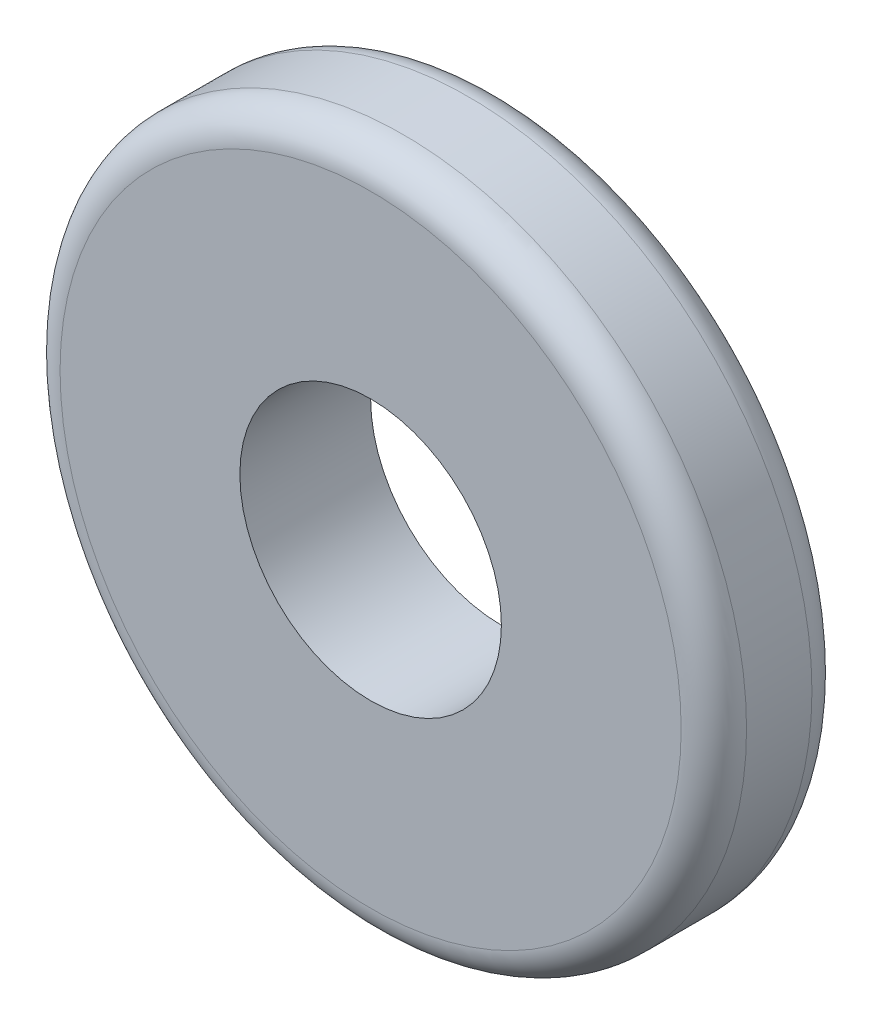
ISO-10303-21;
HEADER;
FILE_DESCRIPTION(('STEP AP214'),'2;1');
FILE_NAME('part.step','',(''),(''),'','','');
FILE_SCHEMA(('AUTOMOTIVE_DESIGN { 1 0 10303 214 1 1 1 1 }'));
ENDSEC;
DATA;
#1=APPLICATION_CONTEXT('core data for automotive mechanical design processes');
#2=APPLICATION_PROTOCOL_DEFINITION('international standard','automotive_design',2000,#1);
#3=PRODUCT_CONTEXT('',#1,'mechanical');
#4=PRODUCT('Part','Part','',(#3));
#5=PRODUCT_RELATED_PRODUCT_CATEGORY('part','',(#4));
#6=PRODUCT_DEFINITION_FORMATION('','',#4);
#7=PRODUCT_DEFINITION_CONTEXT('part definition',#1,'design');
#8=PRODUCT_DEFINITION('design','',#6,#7);
#9=PRODUCT_DEFINITION_SHAPE('','',#8);
#10=(LENGTH_UNIT() NAMED_UNIT(*) SI_UNIT(.MILLI.,.METRE.));
#11=(NAMED_UNIT(*) PLANE_ANGLE_UNIT() SI_UNIT($,.RADIAN.));
#12=(NAMED_UNIT(*) SI_UNIT($,.STERADIAN.) SOLID_ANGLE_UNIT());
#13=UNCERTAINTY_MEASURE_WITH_UNIT(LENGTH_MEASURE(1.E-05),#10,'distance_accuracy_value','');
#14=(GEOMETRIC_REPRESENTATION_CONTEXT(3) GLOBAL_UNCERTAINTY_ASSIGNED_CONTEXT((#13)) GLOBAL_UNIT_ASSIGNED_CONTEXT((#10,
#11,#12)) REPRESENTATION_CONTEXT('',''));
#15=CARTESIAN_POINT('',(0.,0.,0.));
#16=DIRECTION('',(0.,0.,1.));
#17=DIRECTION('',(1.,0.,0.));
#18=AXIS2_PLACEMENT_3D('',#15,#16,#17);
#19=CARTESIAN_POINT('',(0.,0.,4.));
#20=DIRECTION('',(0.,0.,1.));
#21=DIRECTION('',(1.,0.,0.));
#22=AXIS2_PLACEMENT_3D('',#19,#20,#21);
#23=PLANE('',#22);
#24=CARTESIAN_POINT('',(0.,0.,4.));
#25=DIRECTION('',(0.,0.,1.));
#26=DIRECTION('',(1.,0.,0.));
#27=AXIS2_PLACEMENT_3D('',#24,#25,#26);
#28=CIRCLE('',#27,9.5);
#29=CARTESIAN_POINT('',(9.5,0.,4.));
#30=VERTEX_POINT('',#29);
#31=EDGE_CURVE('E10',#30,#30,#28,.T.);
#32=ORIENTED_EDGE('',*,*,#31,.T.);
#33=EDGE_LOOP('',(#32));
#34=FACE_BOUND('',#33,.T.);
#35=CARTESIAN_POINT('',(0.,0.,4.));
#36=DIRECTION('',(0.,0.,1.));
#37=DIRECTION('',(1.,0.,0.));
#38=AXIS2_PLACEMENT_3D('',#35,#36,#37);
#39=CIRCLE('',#38,4.);
#40=CARTESIAN_POINT('',(4.,0.,4.));
#41=VERTEX_POINT('',#40);
#42=EDGE_CURVE('E52',#41,#41,#39,.T.);
#43=ORIENTED_EDGE('',*,*,#42,.F.);
#44=EDGE_LOOP('',(#43));
#45=FACE_BOUND('',#44,.T.);
#46=ADVANCED_FACE('F32',(#34,#45),#23,.T.);
#47=CARTESIAN_POINT('',(0.,0.,0.));
#48=DIRECTION('',(0.,0.,1.));
#49=DIRECTION('',(1.,0.,0.));
#50=AXIS2_PLACEMENT_3D('',#47,#48,#49);
#51=PLANE('',#50);
#52=CARTESIAN_POINT('',(0.,0.,0.));
#53=DIRECTION('',(0.,0.,1.));
#54=DIRECTION('',(1.,0.,0.));
#55=AXIS2_PLACEMENT_3D('',#52,#53,#54);
#56=CIRCLE('',#55,9.5);
#57=CARTESIAN_POINT('',(9.5,0.,0.));
#58=VERTEX_POINT('',#57);
#59=EDGE_CURVE('E39',#58,#58,#56,.F.);
#60=ORIENTED_EDGE('',*,*,#59,.T.);
#61=EDGE_LOOP('',(#60));
#62=FACE_BOUND('',#61,.T.);
#63=CARTESIAN_POINT('',(0.,0.,0.));
#64=DIRECTION('',(0.,0.,1.));
#65=DIRECTION('',(1.,0.,0.));
#66=AXIS2_PLACEMENT_3D('',#63,#64,#65);
#67=CIRCLE('',#66,4.);
#68=CARTESIAN_POINT('',(4.,0.,0.));
#69=VERTEX_POINT('',#68);
#70=EDGE_CURVE('E53',#69,#69,#67,.T.);
#71=ORIENTED_EDGE('',*,*,#70,.T.);
#72=EDGE_LOOP('',(#71));
#73=FACE_BOUND('',#72,.T.);
#74=ADVANCED_FACE('F63',(#62,#73),#51,.F.);
#75=CARTESIAN_POINT('',(0.,0.,4.));
#76=DIRECTION('',(0.,0.,-1.));
#77=DIRECTION('',(-1.,0.,0.));
#78=AXIS2_PLACEMENT_3D('',#75,#76,#77);
#79=CYLINDRICAL_SURFACE('',#78,10.5);
#80=CARTESIAN_POINT('',(0.,0.,1.));
#81=DIRECTION('',(0.,0.,1.));
#82=DIRECTION('',(1.,0.,0.));
#83=AXIS2_PLACEMENT_3D('',#80,#81,#82);
#84=CIRCLE('',#83,10.5);
#85=CARTESIAN_POINT('',(10.5,0.,1.));
#86=VERTEX_POINT('',#85);
#87=EDGE_CURVE('E43',#86,#86,#84,.T.);
#88=ORIENTED_EDGE('',*,*,#87,.T.);
#89=EDGE_LOOP('',(#88));
#90=FACE_BOUND('',#89,.T.);
#91=CARTESIAN_POINT('',(0.,0.,3.));
#92=DIRECTION('',(0.,0.,1.));
#93=DIRECTION('',(1.,0.,0.));
#94=AXIS2_PLACEMENT_3D('',#91,#92,#93);
#95=CIRCLE('',#94,10.5);
#96=CARTESIAN_POINT('',(10.5,0.,3.));
#97=VERTEX_POINT('',#96);
#98=EDGE_CURVE('E47',#97,#97,#95,.F.);
#99=ORIENTED_EDGE('',*,*,#98,.T.);
#100=EDGE_LOOP('',(#99));
#101=FACE_BOUND('',#100,.T.);
#102=ADVANCED_FACE('F68',(#90,#101),#79,.T.);
#103=CARTESIAN_POINT('',(0.,0.,4.));
#104=DIRECTION('',(0.,0.,-1.));
#105=DIRECTION('',(-1.,0.,0.));
#106=AXIS2_PLACEMENT_3D('',#103,#104,#105);
#107=CYLINDRICAL_SURFACE('',#106,4.);
#108=ORIENTED_EDGE('',*,*,#42,.T.);
#109=EDGE_LOOP('',(#108));
#110=FACE_BOUND('',#109,.T.);
#111=ORIENTED_EDGE('',*,*,#70,.F.);
#112=EDGE_LOOP('',(#111));
#113=FACE_BOUND('',#112,.T.);
#114=ADVANCED_FACE('F59',(#110,#113),#107,.F.);
#115=CARTESIAN_POINT('',(0.,0.,1.));
#116=DIRECTION('',(0.,0.,1.));
#117=DIRECTION('',(1.,0.,0.));
#118=AXIS2_PLACEMENT_3D('',#115,#116,#117);
#119=TOROIDAL_SURFACE('',#118,9.5,1.);
#120=ORIENTED_EDGE('',*,*,#59,.F.);
#121=EDGE_LOOP('',(#120));
#122=FACE_BOUND('',#121,.T.);
#123=ORIENTED_EDGE('',*,*,#87,.F.);
#124=EDGE_LOOP('',(#123));
#125=FACE_BOUND('',#124,.T.);
#126=ADVANCED_FACE('F74',(#122,#125),#119,.T.);
#127=CARTESIAN_POINT('',(0.,0.,3.));
#128=DIRECTION('',(0.,0.,1.));
#129=DIRECTION('',(1.,0.,0.));
#130=AXIS2_PLACEMENT_3D('',#127,#128,#129);
#131=TOROIDAL_SURFACE('',#130,9.5,1.);
#132=ORIENTED_EDGE('',*,*,#98,.F.);
#133=EDGE_LOOP('',(#132));
#134=FACE_BOUND('',#133,.T.);
#135=ORIENTED_EDGE('',*,*,#31,.F.);
#136=EDGE_LOOP('',(#135));
#137=FACE_BOUND('',#136,.T.);
#138=ADVANCED_FACE('F34',(#134,#137),#131,.T.);
#139=CLOSED_SHELL('',(#46,#74,#102,#114,#126,#138));
#140=MANIFOLD_SOLID_BREP('B2',#139);
#141=ADVANCED_BREP_SHAPE_REPRESENTATION('',(#18,#140),#14);
#142=SHAPE_DEFINITION_REPRESENTATION(#9,#141);
ENDSEC;
END-ISO-10303-21;
